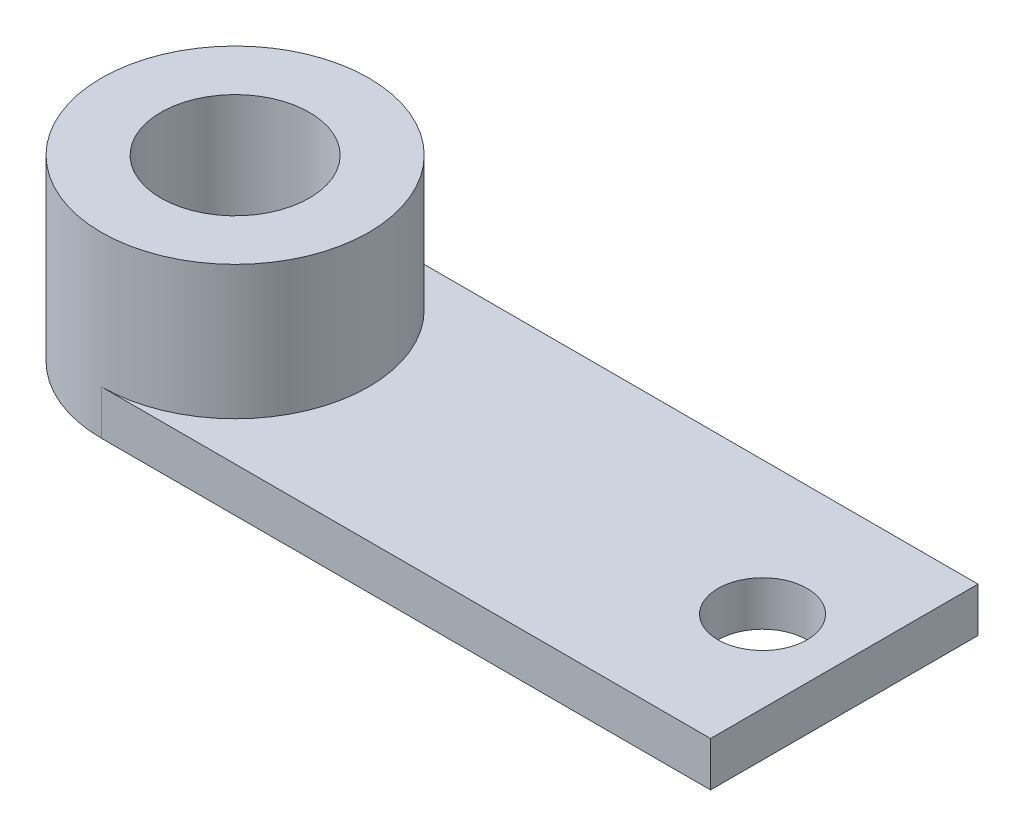
ISO-10303-21;
HEADER;
FILE_DESCRIPTION(('STEP AP214'),'2;1');
FILE_NAME('part.step','',(''),(''),'','','');
FILE_SCHEMA(('AUTOMOTIVE_DESIGN { 1 0 10303 214 1 1 1 1 }'));
ENDSEC;
DATA;
#1=APPLICATION_CONTEXT('core data for automotive mechanical design processes');
#2=APPLICATION_PROTOCOL_DEFINITION('international standard','automotive_design',2000,#1);
#3=PRODUCT_CONTEXT('',#1,'mechanical');
#4=PRODUCT('Part','Part','',(#3));
#5=PRODUCT_RELATED_PRODUCT_CATEGORY('part','',(#4));
#6=PRODUCT_DEFINITION_FORMATION('','',#4);
#7=PRODUCT_DEFINITION_CONTEXT('part definition',#1,'design');
#8=PRODUCT_DEFINITION('design','',#6,#7);
#9=PRODUCT_DEFINITION_SHAPE('','',#8);
#10=(LENGTH_UNIT() NAMED_UNIT(*) SI_UNIT(.MILLI.,.METRE.));
#11=(NAMED_UNIT(*) PLANE_ANGLE_UNIT() SI_UNIT($,.RADIAN.));
#12=(NAMED_UNIT(*) SI_UNIT($,.STERADIAN.) SOLID_ANGLE_UNIT());
#13=UNCERTAINTY_MEASURE_WITH_UNIT(LENGTH_MEASURE(1.E-05),#10,'distance_accuracy_value','');
#14=(GEOMETRIC_REPRESENTATION_CONTEXT(3) GLOBAL_UNCERTAINTY_ASSIGNED_CONTEXT((#13)) GLOBAL_UNIT_ASSIGNED_CONTEXT((#10,
#11,#12)) REPRESENTATION_CONTEXT('',''));
#15=CARTESIAN_POINT('',(0.,0.,0.));
#16=DIRECTION('',(0.,0.,1.));
#17=DIRECTION('',(1.,0.,0.));
#18=AXIS2_PLACEMENT_3D('',#15,#16,#17);
#19=CARTESIAN_POINT('',(0.,6.,0.));
#20=DIRECTION('',(0.,1.,0.));
#21=DIRECTION('',(0.,0.,1.));
#22=AXIS2_PLACEMENT_3D('',#19,#20,#21);
#23=PLANE('',#22);
#24=CARTESIAN_POINT('',(4.5,6.,-4.5));
#25=DIRECTION('',(0.,1.,0.));
#26=DIRECTION('',(0.,0.,1.));
#27=AXIS2_PLACEMENT_3D('',#24,#25,#26);
#28=CIRCLE('',#27,2.5);
#29=CARTESIAN_POINT('',(4.5,6.,-2.));
#30=VERTEX_POINT('',#29);
#31=EDGE_CURVE('E95',#30,#30,#28,.T.);
#32=ORIENTED_EDGE('',*,*,#31,.F.);
#33=EDGE_LOOP('',(#32));
#34=FACE_BOUND('',#33,.T.);
#35=CARTESIAN_POINT('',(4.5,6.,-4.5));
#36=DIRECTION('',(0.,1.,0.));
#37=DIRECTION('',(0.,0.,1.));
#38=AXIS2_PLACEMENT_3D('',#35,#36,#37);
#39=CIRCLE('',#38,4.5);
#40=CARTESIAN_POINT('',(4.5,6.,0.));
#41=VERTEX_POINT('',#40);
#42=EDGE_CURVE('E102',#41,#41,#39,.T.);
#43=ORIENTED_EDGE('',*,*,#42,.T.);
#44=EDGE_LOOP('',(#43));
#45=FACE_BOUND('',#44,.T.);
#46=ADVANCED_FACE('F33',(#34,#45),#23,.T.);
#47=CARTESIAN_POINT('',(0.,0.,0.));
#48=DIRECTION('',(0.,1.,0.));
#49=DIRECTION('',(0.,0.,1.));
#50=AXIS2_PLACEMENT_3D('',#47,#48,#49);
#51=PLANE('',#50);
#52=CARTESIAN_POINT('',(22.25,0.,-4.5));
#53=DIRECTION('',(0.,1.,0.));
#54=DIRECTION('',(0.,0.,1.));
#55=AXIS2_PLACEMENT_3D('',#52,#53,#54);
#56=CIRCLE('',#55,1.5);
#57=CARTESIAN_POINT('',(22.25,0.,-3.));
#58=VERTEX_POINT('',#57);
#59=EDGE_CURVE('E114',#58,#58,#56,.T.);
#60=ORIENTED_EDGE('',*,*,#59,.T.);
#61=EDGE_LOOP('',(#60));
#62=FACE_BOUND('',#61,.T.);
#63=DIRECTION('',(1.,0.,0.));
#64=VECTOR('',#63,1.);
#65=CARTESIAN_POINT('',(0.,0.,0.));
#66=LINE('',#65,#64);
#67=CARTESIAN_POINT('',(4.5,0.,0.));
#68=VERTEX_POINT('',#67);
#69=CARTESIAN_POINT('',(25.,0.,0.));
#70=VERTEX_POINT('',#69);
#71=EDGE_CURVE('E55',#68,#70,#66,.T.);
#72=ORIENTED_EDGE('',*,*,#71,.F.);
#73=CARTESIAN_POINT('',(4.5,0.,-4.5));
#74=DIRECTION('',(0.,1.,0.));
#75=DIRECTION('',(0.,0.,1.));
#76=AXIS2_PLACEMENT_3D('',#73,#74,#75);
#77=CIRCLE('',#76,4.5);
#78=CARTESIAN_POINT('',(4.5,0.,-9.));
#79=VERTEX_POINT('',#78);
#80=EDGE_CURVE('E75',#79,#68,#77,.T.);
#81=ORIENTED_EDGE('',*,*,#80,.F.);
#82=DIRECTION('',(-1.,0.,0.));
#83=VECTOR('',#82,1.);
#84=CARTESIAN_POINT('',(25.,0.,-9.));
#85=LINE('',#84,#83);
#86=CARTESIAN_POINT('',(25.,0.,-9.));
#87=VERTEX_POINT('',#86);
#88=EDGE_CURVE('E92',#87,#79,#85,.T.);
#89=ORIENTED_EDGE('',*,*,#88,.F.);
#90=DIRECTION('',(0.,0.,-1.));
#91=VECTOR('',#90,1.);
#92=CARTESIAN_POINT('',(25.,0.,0.));
#93=LINE('',#92,#91);
#94=EDGE_CURVE('E89',#70,#87,#93,.T.);
#95=ORIENTED_EDGE('',*,*,#94,.F.);
#96=EDGE_LOOP('',(#72,#81,#89,#95));
#97=FACE_BOUND('',#96,.T.);
#98=ADVANCED_FACE('F88',(#62,#97),#51,.F.);
#99=CARTESIAN_POINT('',(0.,6.,0.));
#100=DIRECTION('',(0.,0.,-1.));
#101=DIRECTION('',(-1.,0.,0.));
#102=AXIS2_PLACEMENT_3D('',#99,#100,#101);
#103=PLANE('',#102);
#104=DIRECTION('',(0.,1.,0.));
#105=VECTOR('',#104,1.);
#106=CARTESIAN_POINT('',(4.5,0.,0.));
#107=LINE('',#106,#105);
#108=CARTESIAN_POINT('',(4.5,1.5,0.));
#109=VERTEX_POINT('',#108);
#110=EDGE_CURVE('E78',#68,#109,#107,.T.);
#111=ORIENTED_EDGE('',*,*,#110,.F.);
#112=ORIENTED_EDGE('',*,*,#71,.T.);
#113=DIRECTION('',(0.,-1.,0.));
#114=VECTOR('',#113,1.);
#115=CARTESIAN_POINT('',(25.,6.,0.));
#116=LINE('',#115,#114);
#117=CARTESIAN_POINT('',(25.,1.5,0.));
#118=VERTEX_POINT('',#117);
#119=EDGE_CURVE('E11',#118,#70,#116,.T.);
#120=ORIENTED_EDGE('',*,*,#119,.F.);
#121=DIRECTION('',(1.,0.,0.));
#122=VECTOR('',#121,1.);
#123=CARTESIAN_POINT('',(0.,1.5,0.));
#124=LINE('',#123,#122);
#125=EDGE_CURVE('E85',#109,#118,#124,.T.);
#126=ORIENTED_EDGE('',*,*,#125,.F.);
#127=EDGE_LOOP('',(#111,#112,#120,#126));
#128=FACE_BOUND('',#127,.T.);
#129=ADVANCED_FACE('F35',(#128),#103,.F.);
#130=CARTESIAN_POINT('',(25.,6.,0.));
#131=DIRECTION('',(-1.,0.,0.));
#132=DIRECTION('',(0.,0.,1.));
#133=AXIS2_PLACEMENT_3D('',#130,#131,#132);
#134=PLANE('',#133);
#135=DIRECTION('',(0.,0.,-1.));
#136=VECTOR('',#135,1.);
#137=CARTESIAN_POINT('',(25.,1.5,0.));
#138=LINE('',#137,#136);
#139=CARTESIAN_POINT('',(25.,1.5,-9.));
#140=VERTEX_POINT('',#139);
#141=EDGE_CURVE('E110',#118,#140,#138,.T.);
#142=ORIENTED_EDGE('',*,*,#141,.F.);
#143=ORIENTED_EDGE('',*,*,#119,.T.);
#144=ORIENTED_EDGE('',*,*,#94,.T.);
#145=DIRECTION('',(0.,-1.,0.));
#146=VECTOR('',#145,1.);
#147=CARTESIAN_POINT('',(25.,6.,-9.));
#148=LINE('',#147,#146);
#149=EDGE_CURVE('E41',#140,#87,#148,.T.);
#150=ORIENTED_EDGE('',*,*,#149,.F.);
#151=EDGE_LOOP('',(#142,#143,#144,#150));
#152=FACE_BOUND('',#151,.T.);
#153=ADVANCED_FACE('F155',(#152),#134,.F.);
#154=CARTESIAN_POINT('',(25.,6.,-9.));
#155=DIRECTION('',(0.,0.,1.));
#156=DIRECTION('',(1.,0.,0.));
#157=AXIS2_PLACEMENT_3D('',#154,#155,#156);
#158=PLANE('',#157);
#159=ORIENTED_EDGE('',*,*,#88,.T.);
#160=DIRECTION('',(0.,1.,0.));
#161=VECTOR('',#160,1.);
#162=CARTESIAN_POINT('',(4.5,0.,-9.));
#163=LINE('',#162,#161);
#164=CARTESIAN_POINT('',(4.5,1.5,-9.));
#165=VERTEX_POINT('',#164);
#166=EDGE_CURVE('E80',#79,#165,#163,.T.);
#167=ORIENTED_EDGE('',*,*,#166,.T.);
#168=DIRECTION('',(-1.,0.,0.));
#169=VECTOR('',#168,1.);
#170=CARTESIAN_POINT('',(0.,1.5,-9.));
#171=LINE('',#170,#169);
#172=EDGE_CURVE('E101',#140,#165,#171,.T.);
#173=ORIENTED_EDGE('',*,*,#172,.F.);
#174=ORIENTED_EDGE('',*,*,#149,.T.);
#175=EDGE_LOOP('',(#159,#167,#173,#174));
#176=FACE_BOUND('',#175,.T.);
#177=ADVANCED_FACE('F99',(#176),#158,.F.);
#178=CARTESIAN_POINT('',(22.25,0.,-4.5));
#179=DIRECTION('',(0.,1.,0.));
#180=DIRECTION('',(0.,0.,1.));
#181=AXIS2_PLACEMENT_3D('',#178,#179,#180);
#182=CYLINDRICAL_SURFACE('',#181,1.5);
#183=ORIENTED_EDGE('',*,*,#59,.F.);
#184=EDGE_LOOP('',(#183));
#185=FACE_BOUND('',#184,.T.);
#186=CARTESIAN_POINT('',(22.25,1.5,-4.5));
#187=DIRECTION('',(0.,1.,0.));
#188=DIRECTION('',(0.,0.,1.));
#189=AXIS2_PLACEMENT_3D('',#186,#187,#188);
#190=CIRCLE('',#189,1.5);
#191=CARTESIAN_POINT('',(22.25,1.5,-3.));
#192=VERTEX_POINT('',#191);
#193=EDGE_CURVE('E111',#192,#192,#190,.F.);
#194=ORIENTED_EDGE('',*,*,#193,.F.);
#195=EDGE_LOOP('',(#194));
#196=FACE_BOUND('',#195,.T.);
#197=ADVANCED_FACE('F145',(#185,#196),#182,.F.);
#198=CARTESIAN_POINT('',(4.5,1.5,-4.5));
#199=DIRECTION('',(0.,1.,0.));
#200=DIRECTION('',(0.,0.,1.));
#201=AXIS2_PLACEMENT_3D('',#198,#199,#200);
#202=CYLINDRICAL_SURFACE('',#201,2.5);
#203=CARTESIAN_POINT('',(4.5,1.5,-4.5));
#204=DIRECTION('',(0.,1.,0.));
#205=DIRECTION('',(0.,0.,1.));
#206=AXIS2_PLACEMENT_3D('',#203,#204,#205);
#207=CIRCLE('',#206,2.5);
#208=CARTESIAN_POINT('',(4.5,1.5,-2.));
#209=VERTEX_POINT('',#208);
#210=EDGE_CURVE('E90',#209,#209,#207,.T.);
#211=ORIENTED_EDGE('',*,*,#210,.F.);
#212=EDGE_LOOP('',(#211));
#213=FACE_BOUND('',#212,.T.);
#214=ORIENTED_EDGE('',*,*,#31,.T.);
#215=EDGE_LOOP('',(#214));
#216=FACE_BOUND('',#215,.T.);
#217=ADVANCED_FACE('F127',(#213,#216),#202,.F.);
#218=CARTESIAN_POINT('',(4.5,1.5,-4.5));
#219=DIRECTION('',(0.,1.,0.));
#220=DIRECTION('',(0.,0.,1.));
#221=AXIS2_PLACEMENT_3D('',#218,#219,#220);
#222=PLANE('',#221);
#223=ORIENTED_EDGE('',*,*,#210,.T.);
#224=EDGE_LOOP('',(#223));
#225=FACE_BOUND('',#224,.T.);
#226=ADVANCED_FACE('F135',(#225),#222,.T.);
#227=CARTESIAN_POINT('',(4.5,1.5,-4.5));
#228=DIRECTION('',(0.,1.,0.));
#229=DIRECTION('',(0.,0.,1.));
#230=AXIS2_PLACEMENT_3D('',#227,#228,#229);
#231=CYLINDRICAL_SURFACE('',#230,4.5);
#232=ORIENTED_EDGE('',*,*,#42,.F.);
#233=EDGE_LOOP('',(#232));
#234=FACE_BOUND('',#233,.T.);
#235=ORIENTED_EDGE('',*,*,#110,.T.);
#236=CARTESIAN_POINT('',(4.5,1.5,-4.5));
#237=DIRECTION('',(0.,1.,0.));
#238=DIRECTION('',(0.,0.,1.));
#239=AXIS2_PLACEMENT_3D('',#236,#237,#238);
#240=CIRCLE('',#239,4.5);
#241=EDGE_CURVE('E104',#109,#165,#240,.T.);
#242=ORIENTED_EDGE('',*,*,#241,.T.);
#243=ORIENTED_EDGE('',*,*,#166,.F.);
#244=ORIENTED_EDGE('',*,*,#80,.T.);
#245=EDGE_LOOP('',(#235,#242,#243,#244));
#246=FACE_BOUND('',#245,.T.);
#247=ADVANCED_FACE('F76',(#234,#246),#231,.T.);
#248=CARTESIAN_POINT('',(0.,1.5,0.));
#249=DIRECTION('',(0.,1.,0.));
#250=DIRECTION('',(0.,0.,1.));
#251=AXIS2_PLACEMENT_3D('',#248,#249,#250);
#252=PLANE('',#251);
#253=ORIENTED_EDGE('',*,*,#241,.F.);
#254=ORIENTED_EDGE('',*,*,#125,.T.);
#255=ORIENTED_EDGE('',*,*,#141,.T.);
#256=ORIENTED_EDGE('',*,*,#172,.T.);
#257=EDGE_LOOP('',(#253,#254,#255,#256));
#258=FACE_BOUND('',#257,.T.);
#259=ORIENTED_EDGE('',*,*,#193,.T.);
#260=EDGE_LOOP('',(#259));
#261=FACE_BOUND('',#260,.T.);
#262=ADVANCED_FACE('F107',(#258,#261),#252,.T.);
#263=CLOSED_SHELL('',(#46,#98,#129,#153,#177,#197,#217,#226,#247,#262));
#264=MANIFOLD_SOLID_BREP('B2',#263);
#265=ADVANCED_BREP_SHAPE_REPRESENTATION('',(#18,#264),#14);
#266=SHAPE_DEFINITION_REPRESENTATION(#9,#265);
ENDSEC;
END-ISO-10303-21;
